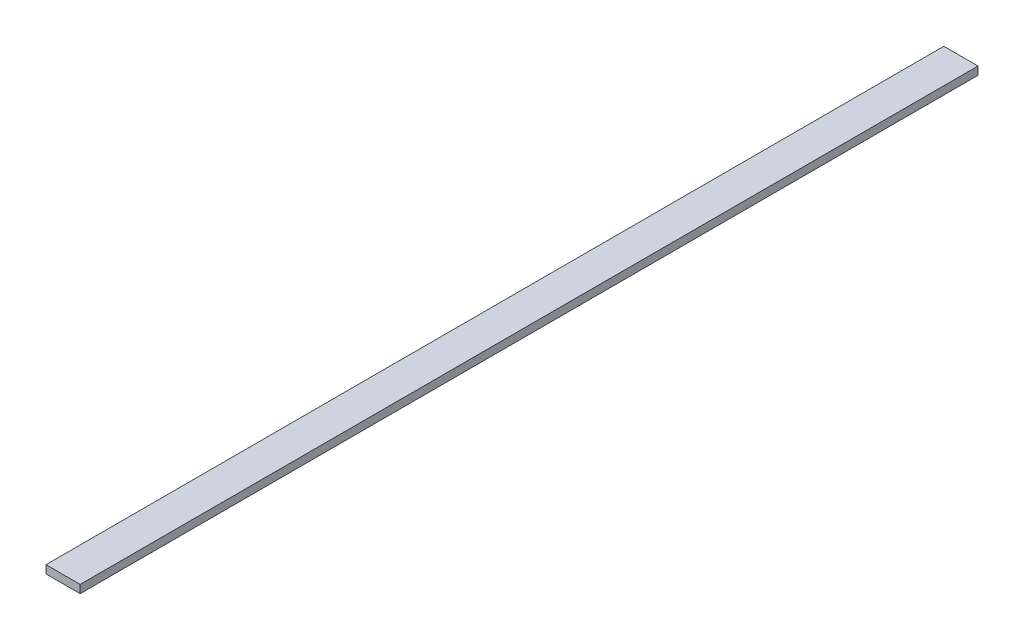
ISO-10303-21;
HEADER;
FILE_DESCRIPTION(('STEP AP214'),'2;1');
FILE_NAME('part.step','',(''),(''),'','','');
FILE_SCHEMA(('AUTOMOTIVE_DESIGN { 1 0 10303 214 1 1 1 1 }'));
ENDSEC;
DATA;
#1=APPLICATION_CONTEXT('core data for automotive mechanical design processes');
#2=APPLICATION_PROTOCOL_DEFINITION('international standard','automotive_design',2000,#1);
#3=PRODUCT_CONTEXT('',#1,'mechanical');
#4=PRODUCT('Part','Part','',(#3));
#5=PRODUCT_RELATED_PRODUCT_CATEGORY('part','',(#4));
#6=PRODUCT_DEFINITION_FORMATION('','',#4);
#7=PRODUCT_DEFINITION_CONTEXT('part definition',#1,'design');
#8=PRODUCT_DEFINITION('design','',#6,#7);
#9=PRODUCT_DEFINITION_SHAPE('','',#8);
#10=(LENGTH_UNIT() NAMED_UNIT(*) SI_UNIT(.MILLI.,.METRE.));
#11=(NAMED_UNIT(*) PLANE_ANGLE_UNIT() SI_UNIT($,.RADIAN.));
#12=(NAMED_UNIT(*) SI_UNIT($,.STERADIAN.) SOLID_ANGLE_UNIT());
#13=UNCERTAINTY_MEASURE_WITH_UNIT(LENGTH_MEASURE(1.E-05),#10,'distance_accuracy_value','');
#14=(GEOMETRIC_REPRESENTATION_CONTEXT(3) GLOBAL_UNCERTAINTY_ASSIGNED_CONTEXT((#13)) GLOBAL_UNIT_ASSIGNED_CONTEXT((#10,
#11,#12)) REPRESENTATION_CONTEXT('',''));
#15=CARTESIAN_POINT('',(0.,0.,0.));
#16=DIRECTION('',(0.,0.,1.));
#17=DIRECTION('',(1.,0.,0.));
#18=AXIS2_PLACEMENT_3D('',#15,#16,#17);
#19=CARTESIAN_POINT('',(-6.35,-1.5,167.));
#20=DIRECTION('',(1.,0.,0.));
#21=DIRECTION('',(0.,0.,-1.));
#22=AXIS2_PLACEMENT_3D('',#19,#20,#21);
#23=PLANE('',#22);
#24=DIRECTION('',(0.,-1.,0.));
#25=VECTOR('',#24,1.);
#26=CARTESIAN_POINT('',(-6.35,-1.5,-167.));
#27=LINE('',#26,#25);
#28=CARTESIAN_POINT('',(-6.35,1.5,-167.));
#29=VERTEX_POINT('',#28);
#30=CARTESIAN_POINT('',(-6.35,-1.5,-167.));
#31=VERTEX_POINT('',#30);
#32=EDGE_CURVE('E96',#29,#31,#27,.T.);
#33=ORIENTED_EDGE('',*,*,#32,.T.);
#34=DIRECTION('',(0.,0.,-1.));
#35=VECTOR('',#34,1.);
#36=CARTESIAN_POINT('',(-6.35,-1.5,167.));
#37=LINE('',#36,#35);
#38=CARTESIAN_POINT('',(-6.35,-1.5,167.));
#39=VERTEX_POINT('',#38);
#40=EDGE_CURVE('E11',#39,#31,#37,.T.);
#41=ORIENTED_EDGE('',*,*,#40,.F.);
#42=DIRECTION('',(0.,-1.,0.));
#43=VECTOR('',#42,1.);
#44=CARTESIAN_POINT('',(-6.35,-1.5,167.));
#45=LINE('',#44,#43);
#46=CARTESIAN_POINT('',(-6.35,1.5,167.));
#47=VERTEX_POINT('',#46);
#48=EDGE_CURVE('E84',#47,#39,#45,.T.);
#49=ORIENTED_EDGE('',*,*,#48,.F.);
#50=DIRECTION('',(0.,0.,-1.));
#51=VECTOR('',#50,1.);
#52=CARTESIAN_POINT('',(-6.35,1.5,167.));
#53=LINE('',#52,#51);
#54=EDGE_CURVE('E92',#47,#29,#53,.T.);
#55=ORIENTED_EDGE('',*,*,#54,.T.);
#56=EDGE_LOOP('',(#33,#41,#49,#55));
#57=FACE_BOUND('',#56,.T.);
#58=ADVANCED_FACE('F33',(#57),#23,.F.);
#59=CARTESIAN_POINT('',(6.35,-1.5,167.));
#60=DIRECTION('',(0.,1.,0.));
#61=DIRECTION('',(-1.,0.,0.));
#62=AXIS2_PLACEMENT_3D('',#59,#60,#61);
#63=PLANE('',#62);
#64=DIRECTION('',(1.,0.,0.));
#65=VECTOR('',#64,1.);
#66=CARTESIAN_POINT('',(6.35,-1.5,-167.));
#67=LINE('',#66,#65);
#68=CARTESIAN_POINT('',(6.35,-1.5,-167.));
#69=VERTEX_POINT('',#68);
#70=EDGE_CURVE('E88',#31,#69,#67,.T.);
#71=ORIENTED_EDGE('',*,*,#70,.T.);
#72=DIRECTION('',(0.,0.,-1.));
#73=VECTOR('',#72,1.);
#74=CARTESIAN_POINT('',(6.35,-1.5,167.));
#75=LINE('',#74,#73);
#76=CARTESIAN_POINT('',(6.35,-1.5,167.));
#77=VERTEX_POINT('',#76);
#78=EDGE_CURVE('E41',#77,#69,#75,.T.);
#79=ORIENTED_EDGE('',*,*,#78,.F.);
#80=DIRECTION('',(1.,0.,0.));
#81=VECTOR('',#80,1.);
#82=CARTESIAN_POINT('',(6.35,-1.5,167.));
#83=LINE('',#82,#81);
#84=EDGE_CURVE('E79',#39,#77,#83,.T.);
#85=ORIENTED_EDGE('',*,*,#84,.F.);
#86=ORIENTED_EDGE('',*,*,#40,.T.);
#87=EDGE_LOOP('',(#71,#79,#85,#86));
#88=FACE_BOUND('',#87,.T.);
#89=ADVANCED_FACE('F87',(#88),#63,.F.);
#90=CARTESIAN_POINT('',(6.35,-1.5,167.));
#91=DIRECTION('',(-1.,0.,0.));
#92=DIRECTION('',(0.,0.,1.));
#93=AXIS2_PLACEMENT_3D('',#90,#91,#92);
#94=PLANE('',#93);
#95=DIRECTION('',(0.,1.,0.));
#96=VECTOR('',#95,1.);
#97=CARTESIAN_POINT('',(6.35,-1.5,-167.));
#98=LINE('',#97,#96);
#99=CARTESIAN_POINT('',(6.35,1.5,-167.));
#100=VERTEX_POINT('',#99);
#101=EDGE_CURVE('E66',#69,#100,#98,.T.);
#102=ORIENTED_EDGE('',*,*,#101,.T.);
#103=DIRECTION('',(0.,0.,-1.));
#104=VECTOR('',#103,1.);
#105=CARTESIAN_POINT('',(6.35,1.5,167.));
#106=LINE('',#105,#104);
#107=CARTESIAN_POINT('',(6.35,1.5,167.));
#108=VERTEX_POINT('',#107);
#109=EDGE_CURVE('E89',#108,#100,#106,.T.);
#110=ORIENTED_EDGE('',*,*,#109,.F.);
#111=DIRECTION('',(0.,1.,0.));
#112=VECTOR('',#111,1.);
#113=CARTESIAN_POINT('',(6.35,-1.5,167.));
#114=LINE('',#113,#112);
#115=EDGE_CURVE('E82',#77,#108,#114,.T.);
#116=ORIENTED_EDGE('',*,*,#115,.F.);
#117=ORIENTED_EDGE('',*,*,#78,.T.);
#118=EDGE_LOOP('',(#102,#110,#116,#117));
#119=FACE_BOUND('',#118,.T.);
#120=ADVANCED_FACE('F90',(#119),#94,.F.);
#121=CARTESIAN_POINT('',(6.35,1.5,167.));
#122=DIRECTION('',(0.,-1.,0.));
#123=DIRECTION('',(1.,0.,0.));
#124=AXIS2_PLACEMENT_3D('',#121,#122,#123);
#125=PLANE('',#124);
#126=DIRECTION('',(-1.,0.,0.));
#127=VECTOR('',#126,1.);
#128=CARTESIAN_POINT('',(6.35,1.5,-167.));
#129=LINE('',#128,#127);
#130=EDGE_CURVE('E72',#100,#29,#129,.T.);
#131=ORIENTED_EDGE('',*,*,#130,.T.);
#132=ORIENTED_EDGE('',*,*,#54,.F.);
#133=DIRECTION('',(-1.,0.,0.));
#134=VECTOR('',#133,1.);
#135=CARTESIAN_POINT('',(6.35,1.5,167.));
#136=LINE('',#135,#134);
#137=EDGE_CURVE('E49',#108,#47,#136,.T.);
#138=ORIENTED_EDGE('',*,*,#137,.F.);
#139=ORIENTED_EDGE('',*,*,#109,.T.);
#140=EDGE_LOOP('',(#131,#132,#138,#139));
#141=FACE_BOUND('',#140,.T.);
#142=ADVANCED_FACE('F103',(#141),#125,.F.);
#143=CARTESIAN_POINT('',(0.,0.,167.));
#144=DIRECTION('',(0.,0.,1.));
#145=DIRECTION('',(1.,0.,0.));
#146=AXIS2_PLACEMENT_3D('',#143,#144,#145);
#147=PLANE('',#146);
#148=ORIENTED_EDGE('',*,*,#48,.T.);
#149=ORIENTED_EDGE('',*,*,#84,.T.);
#150=ORIENTED_EDGE('',*,*,#115,.T.);
#151=ORIENTED_EDGE('',*,*,#137,.T.);
#152=EDGE_LOOP('',(#148,#149,#150,#151));
#153=FACE_BOUND('',#152,.T.);
#154=ADVANCED_FACE('F80',(#153),#147,.T.);
#155=CARTESIAN_POINT('',(0.,0.,-167.));
#156=DIRECTION('',(0.,0.,1.));
#157=DIRECTION('',(1.,0.,0.));
#158=AXIS2_PLACEMENT_3D('',#155,#156,#157);
#159=PLANE('',#158);
#160=ORIENTED_EDGE('',*,*,#32,.F.);
#161=ORIENTED_EDGE('',*,*,#130,.F.);
#162=ORIENTED_EDGE('',*,*,#101,.F.);
#163=ORIENTED_EDGE('',*,*,#70,.F.);
#164=EDGE_LOOP('',(#160,#161,#162,#163));
#165=FACE_BOUND('',#164,.T.);
#166=ADVANCED_FACE('F106',(#165),#159,.F.);
#167=CLOSED_SHELL('',(#58,#89,#120,#142,#154,#166));
#168=MANIFOLD_SOLID_BREP('B2',#167);
#169=ADVANCED_BREP_SHAPE_REPRESENTATION('',(#18,#168),#14);
#170=SHAPE_DEFINITION_REPRESENTATION(#9,#169);
ENDSEC;
END-ISO-10303-21;
